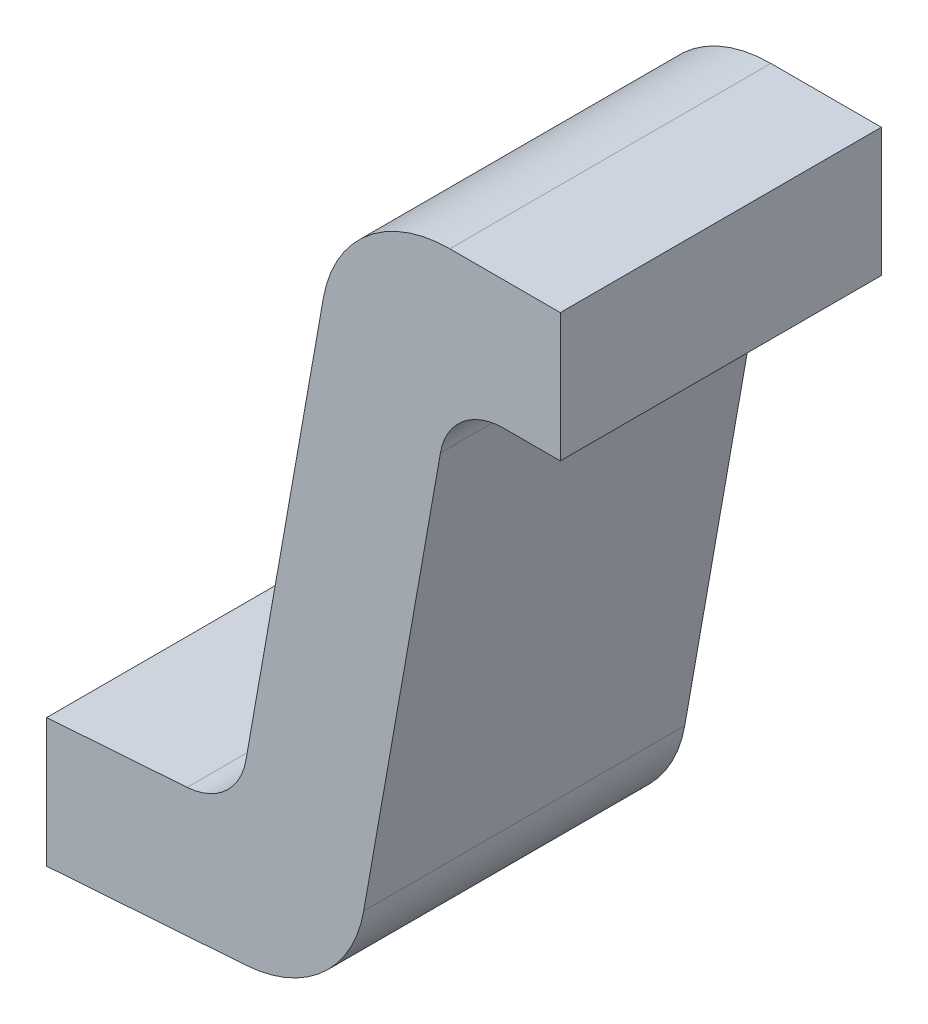
ISO-10303-21;
HEADER;
FILE_DESCRIPTION(('STEP AP214'),'2;1');
FILE_NAME('part.step','',(''),(''),'','','');
FILE_SCHEMA(('AUTOMOTIVE_DESIGN { 1 0 10303 214 1 1 1 1 }'));
ENDSEC;
DATA;
#1=APPLICATION_CONTEXT('core data for automotive mechanical design processes');
#2=APPLICATION_PROTOCOL_DEFINITION('international standard','automotive_design',2000,#1);
#3=PRODUCT_CONTEXT('',#1,'mechanical');
#4=PRODUCT('Part','Part','',(#3));
#5=PRODUCT_RELATED_PRODUCT_CATEGORY('part','',(#4));
#6=PRODUCT_DEFINITION_FORMATION('','',#4);
#7=PRODUCT_DEFINITION_CONTEXT('part definition',#1,'design');
#8=PRODUCT_DEFINITION('design','',#6,#7);
#9=PRODUCT_DEFINITION_SHAPE('','',#8);
#10=(LENGTH_UNIT() NAMED_UNIT(*) SI_UNIT(.MILLI.,.METRE.));
#11=(NAMED_UNIT(*) PLANE_ANGLE_UNIT() SI_UNIT($,.RADIAN.));
#12=(NAMED_UNIT(*) SI_UNIT($,.STERADIAN.) SOLID_ANGLE_UNIT());
#13=UNCERTAINTY_MEASURE_WITH_UNIT(LENGTH_MEASURE(1.E-05),#10,'distance_accuracy_value','');
#14=(GEOMETRIC_REPRESENTATION_CONTEXT(3) GLOBAL_UNCERTAINTY_ASSIGNED_CONTEXT((#13)) GLOBAL_UNIT_ASSIGNED_CONTEXT((#10,
#11,#12)) REPRESENTATION_CONTEXT('',''));
#15=CARTESIAN_POINT('',(0.,0.,0.));
#16=DIRECTION('',(0.,0.,1.));
#17=DIRECTION('',(1.,0.,0.));
#18=AXIS2_PLACEMENT_3D('',#15,#16,#17);
#19=CARTESIAN_POINT('',(0.35,0.02447438418023,0.));
#20=DIRECTION('',(0.98480775301219,-0.173648177667033,0.));
#21=DIRECTION('',(0.173648177667033,0.98480775301219,0.));
#22=AXIS2_PLACEMENT_3D('',#19,#20,#21);
#23=PLANE('',#22);
#24=DIRECTION('',(0.,0.,1.));
#25=VECTOR('',#24,1.);
#26=CARTESIAN_POINT('',(0.370350323791843,0.139886805525028,0.));
#27=LINE('',#26,#25);
#28=CARTESIAN_POINT('',(0.370350323791921,0.13988680552501,0.));
#29=VERTEX_POINT('',#28);
#30=CARTESIAN_POINT('',(0.370350323791921,0.13988680552501,0.375));
#31=VERTEX_POINT('',#30);
#32=EDGE_CURVE('E82',#29,#31,#27,.T.);
#33=ORIENTED_EDGE('',*,*,#32,.F.);
#34=DIRECTION('',(0.173648177666533,0.984807753012278,0.));
#35=VECTOR('',#34,1.);
#36=CARTESIAN_POINT('',(0.370350323792,0.139886805525,0.));
#37=LINE('',#36,#35);
#38=CARTESIAN_POINT('',(0.45994855289804,0.648023613324995,0.));
#39=VERTEX_POINT('',#38);
#40=EDGE_CURVE('E118',#29,#39,#37,.T.);
#41=ORIENTED_EDGE('',*,*,#40,.T.);
#42=DIRECTION('',(0.,0.,1.));
#43=VECTOR('',#42,1.);
#44=CARTESIAN_POINT('',(0.459948552898078,0.648023613324986,0.));
#45=LINE('',#44,#43);
#46=CARTESIAN_POINT('',(0.45994855289804,0.648023613324995,0.375));
#47=VERTEX_POINT('',#46);
#48=EDGE_CURVE('E96',#39,#47,#45,.T.);
#49=ORIENTED_EDGE('',*,*,#48,.T.);
#50=DIRECTION('',(0.173648177666533,0.984807753012278,0.));
#51=VECTOR('',#50,1.);
#52=CARTESIAN_POINT('',(0.370350323792,0.139886805525,0.375));
#53=LINE('',#52,#51);
#54=EDGE_CURVE('E94',#31,#47,#53,.T.);
#55=ORIENTED_EDGE('',*,*,#54,.F.);
#56=EDGE_LOOP('',(#33,#41,#49,#55));
#57=FACE_BOUND('',#56,.T.);
#58=ADVANCED_FACE('F17',(#57),#23,.T.);
#59=CARTESIAN_POINT('',(0.533809134374,0.635,0.));
#60=DIRECTION('',(0.,0.,1.));
#61=DIRECTION('',(1.,0.,0.));
#62=AXIS2_PLACEMENT_3D('',#59,#60,#61);
#63=CYLINDRICAL_SURFACE('',#62,0.075);
#64=DIRECTION('',(0.,0.,-1.));
#65=VECTOR('',#64,1.);
#66=CARTESIAN_POINT('',(0.533809134374,0.71,0.));
#67=LINE('',#66,#65);
#68=CARTESIAN_POINT('',(0.533809134374,0.71,0.375));
#69=VERTEX_POINT('',#68);
#70=CARTESIAN_POINT('',(0.533809134374,0.71,0.));
#71=VERTEX_POINT('',#70);
#72=EDGE_CURVE('E136',#69,#71,#67,.T.);
#73=ORIENTED_EDGE('',*,*,#72,.F.);
#74=CARTESIAN_POINT('',(0.533809134374,0.635,0.375));
#75=DIRECTION('',(0.,0.,1.));
#76=DIRECTION('',(1.,0.,0.));
#77=AXIS2_PLACEMENT_3D('',#74,#75,#76);
#78=CIRCLE('',#77,0.075);
#79=EDGE_CURVE('E100',#47,#69,#78,.F.);
#80=ORIENTED_EDGE('',*,*,#79,.F.);
#81=ORIENTED_EDGE('',*,*,#48,.F.);
#82=CARTESIAN_POINT('',(0.533809134374,0.635,0.));
#83=DIRECTION('',(0.,0.,1.));
#84=DIRECTION('',(1.,0.,0.));
#85=AXIS2_PLACEMENT_3D('',#82,#83,#84);
#86=CIRCLE('',#85,0.075);
#87=EDGE_CURVE('E161',#39,#71,#86,.F.);
#88=ORIENTED_EDGE('',*,*,#87,.T.);
#89=EDGE_LOOP('',(#73,#80,#81,#88));
#90=FACE_BOUND('',#89,.T.);
#91=ADVANCED_FACE('F294',(#90),#63,.F.);
#92=CARTESIAN_POINT('',(0.470876662036,0.71,0.));
#93=DIRECTION('',(0.,-1.,0.));
#94=DIRECTION('',(0.,0.,-1.));
#95=AXIS2_PLACEMENT_3D('',#92,#93,#94);
#96=PLANE('',#95);
#97=DIRECTION('',(0.,0.,1.));
#98=VECTOR('',#97,1.);
#99=CARTESIAN_POINT('',(0.6,0.71,0.));
#100=LINE('',#99,#98);
#101=CARTESIAN_POINT('',(0.6,0.71,0.375));
#102=VERTEX_POINT('',#101);
#103=CARTESIAN_POINT('',(0.6,0.71,0.));
#104=VERTEX_POINT('',#103);
#105=EDGE_CURVE('E124',#102,#104,#100,.F.);
#106=ORIENTED_EDGE('',*,*,#105,.F.);
#107=DIRECTION('',(1.,0.,0.));
#108=VECTOR('',#107,1.);
#109=CARTESIAN_POINT('',(0.320224528212,0.71,0.375));
#110=LINE('',#109,#108);
#111=EDGE_CURVE('E151',#69,#102,#110,.T.);
#112=ORIENTED_EDGE('',*,*,#111,.F.);
#113=ORIENTED_EDGE('',*,*,#72,.T.);
#114=DIRECTION('',(1.,0.,0.));
#115=VECTOR('',#114,1.);
#116=CARTESIAN_POINT('',(0.320224528212,0.71,0.));
#117=LINE('',#116,#115);
#118=EDGE_CURVE('E131',#71,#104,#117,.T.);
#119=ORIENTED_EDGE('',*,*,#118,.T.);
#120=EDGE_LOOP('',(#106,#112,#113,#119));
#121=FACE_BOUND('',#120,.T.);
#122=ADVANCED_FACE('F288',(#121),#96,.T.);
#123=CARTESIAN_POINT('',(0.6,0.71,0.));
#124=DIRECTION('',(1.,0.,0.));
#125=DIRECTION('',(0.,1.,0.));
#126=AXIS2_PLACEMENT_3D('',#123,#124,#125);
#127=PLANE('',#126);
#128=DIRECTION('',(0.,1.,0.));
#129=VECTOR('',#128,1.);
#130=CARTESIAN_POINT('',(0.6,0.412415878806,0.375));
#131=LINE('',#130,#129);
#132=CARTESIAN_POINT('',(0.6,0.86,0.375));
#133=VERTEX_POINT('',#132);
#134=EDGE_CURVE('E147',#102,#133,#131,.T.);
#135=ORIENTED_EDGE('',*,*,#134,.F.);
#136=ORIENTED_EDGE('',*,*,#105,.T.);
#137=DIRECTION('',(0.,1.,0.));
#138=VECTOR('',#137,1.);
#139=CARTESIAN_POINT('',(0.6,0.412415878806,0.));
#140=LINE('',#139,#138);
#141=CARTESIAN_POINT('',(0.6,0.86,0.));
#142=VERTEX_POINT('',#141);
#143=EDGE_CURVE('E127',#104,#142,#140,.T.);
#144=ORIENTED_EDGE('',*,*,#143,.T.);
#145=DIRECTION('',(0.,0.,1.));
#146=VECTOR('',#145,1.);
#147=CARTESIAN_POINT('',(0.6,0.86,0.));
#148=LINE('',#147,#146);
#149=EDGE_CURVE('E120',#133,#142,#148,.F.);
#150=ORIENTED_EDGE('',*,*,#149,.F.);
#151=EDGE_LOOP('',(#135,#136,#144,#150));
#152=FACE_BOUND('',#151,.T.);
#153=ADVANCED_FACE('F255',(#152),#127,.T.);
#154=CARTESIAN_POINT('',(0.6,0.86,0.));
#155=DIRECTION('',(0.,1.,0.));
#156=DIRECTION('',(0.,0.,1.));
#157=AXIS2_PLACEMENT_3D('',#154,#155,#156);
#158=PLANE('',#157);
#159=ORIENTED_EDGE('',*,*,#149,.T.);
#160=DIRECTION('',(1.,0.,0.));
#161=VECTOR('',#160,1.);
#162=CARTESIAN_POINT('',(0.320224528212,0.86,0.));
#163=LINE('',#162,#161);
#164=CARTESIAN_POINT('',(0.470876662036,0.86,0.));
#165=VERTEX_POINT('',#164);
#166=EDGE_CURVE('E130',#142,#165,#163,.F.);
#167=ORIENTED_EDGE('',*,*,#166,.T.);
#168=DIRECTION('',(0.,0.,1.));
#169=VECTOR('',#168,1.);
#170=CARTESIAN_POINT('',(0.470876662036,0.86,0.));
#171=LINE('',#170,#169);
#172=CARTESIAN_POINT('',(0.470876662036,0.86,0.375));
#173=VERTEX_POINT('',#172);
#174=EDGE_CURVE('E116',#173,#165,#171,.F.);
#175=ORIENTED_EDGE('',*,*,#174,.F.);
#176=DIRECTION('',(1.,0.,0.));
#177=VECTOR('',#176,1.);
#178=CARTESIAN_POINT('',(0.320224528212,0.86,0.375));
#179=LINE('',#178,#177);
#180=EDGE_CURVE('E150',#133,#173,#179,.F.);
#181=ORIENTED_EDGE('',*,*,#180,.F.);
#182=EDGE_LOOP('',(#159,#167,#175,#181));
#183=FACE_BOUND('',#182,.T.);
#184=ADVANCED_FACE('F237',(#183),#158,.T.);
#185=CARTESIAN_POINT('',(0.22262916084,0.165934032175,0.));
#186=DIRECTION('',(-0.0697564737441177,0.997564050259825,0.));
#187=DIRECTION('',(-0.997564050259825,-0.0697564737441177,0.));
#188=AXIS2_PLACEMENT_3D('',#185,#186,#187);
#189=PLANE('',#188);
#190=DIRECTION('',(0.,0.,1.));
#191=VECTOR('',#190,1.);
#192=CARTESIAN_POINT('',(0.,0.150366284712,0.));
#193=LINE('',#192,#191);
#194=CARTESIAN_POINT('',(0.,0.150366284712,0.375));
#195=VERTEX_POINT('',#194);
#196=CARTESIAN_POINT('',(0.,0.150366284712,0.));
#197=VERTEX_POINT('',#196);
#198=EDGE_CURVE('E123',#195,#197,#193,.F.);
#199=ORIENTED_EDGE('',*,*,#198,.F.);
#200=DIRECTION('',(-0.997564050259951,-0.069756473742309,0.));
#201=VECTOR('',#200,1.);
#202=CARTESIAN_POINT('',(0.164175476791,0.161846552403,0.375));
#203=LINE('',#202,#201);
#204=CARTESIAN_POINT('',(0.164175476790837,0.161846552403252,0.375));
#205=VERTEX_POINT('',#204);
#206=EDGE_CURVE('E144',#205,#195,#203,.T.);
#207=ORIENTED_EDGE('',*,*,#206,.F.);
#208=DIRECTION('',(0.,0.,1.));
#209=VECTOR('',#208,1.);
#210=CARTESIAN_POINT('',(0.164175476790963,0.161846552403524,0.));
#211=LINE('',#210,#209);
#212=CARTESIAN_POINT('',(0.164175476790837,0.161846552403252,0.));
#213=VERTEX_POINT('',#212);
#214=EDGE_CURVE('E91',#205,#213,#211,.F.);
#215=ORIENTED_EDGE('',*,*,#214,.T.);
#216=DIRECTION('',(-0.997564050259951,-0.069756473742309,0.));
#217=VECTOR('',#216,1.);
#218=CARTESIAN_POINT('',(0.164175476791,0.161846552403,0.));
#219=LINE('',#218,#217);
#220=EDGE_CURVE('E159',#213,#197,#219,.T.);
#221=ORIENTED_EDGE('',*,*,#220,.T.);
#222=EDGE_LOOP('',(#199,#207,#215,#221));
#223=FACE_BOUND('',#222,.T.);
#224=ADVANCED_FACE('F245',(#223),#189,.T.);
#225=CARTESIAN_POINT('',(0.,0.150366284712,0.));
#226=DIRECTION('',(-1.,0.,0.));
#227=DIRECTION('',(0.,-1.,0.));
#228=AXIS2_PLACEMENT_3D('',#225,#226,#227);
#229=PLANE('',#228);
#230=DIRECTION('',(0.,1.,0.));
#231=VECTOR('',#230,1.);
#232=CARTESIAN_POINT('',(0.,0.412415878806,0.375));
#233=LINE('',#232,#231);
#234=CARTESIAN_POINT('',(0.,0.,0.375));
#235=VERTEX_POINT('',#234);
#236=EDGE_CURVE('E142',#195,#235,#233,.F.);
#237=ORIENTED_EDGE('',*,*,#236,.F.);
#238=ORIENTED_EDGE('',*,*,#198,.T.);
#239=DIRECTION('',(0.,1.,0.));
#240=VECTOR('',#239,1.);
#241=CARTESIAN_POINT('',(0.,0.412415878806,0.));
#242=LINE('',#241,#240);
#243=CARTESIAN_POINT('',(0.,0.,0.));
#244=VERTEX_POINT('',#243);
#245=EDGE_CURVE('E182',#197,#244,#242,.F.);
#246=ORIENTED_EDGE('',*,*,#245,.T.);
#247=DIRECTION('',(0.,0.,1.));
#248=VECTOR('',#247,1.);
#249=CARTESIAN_POINT('',(0.,0.,0.));
#250=LINE('',#249,#248);
#251=EDGE_CURVE('E176',#235,#244,#250,.F.);
#252=ORIENTED_EDGE('',*,*,#251,.F.);
#253=EDGE_LOOP('',(#237,#238,#246,#252));
#254=FACE_BOUND('',#253,.T.);
#255=ADVANCED_FACE('F192',(#254),#229,.T.);
#256=CARTESIAN_POINT('',(0.,0.,0.));
#257=DIRECTION('',(0.0697564737441177,-0.997564050259825,0.));
#258=DIRECTION('',(0.997564050259825,0.0697564737441177,0.));
#259=AXIS2_PLACEMENT_3D('',#256,#257,#258);
#260=PLANE('',#259);
#261=ORIENTED_EDGE('',*,*,#251,.T.);
#262=DIRECTION('',(0.997564050259827,0.0697564737440867,0.));
#263=VECTOR('',#262,1.);
#264=CARTESIAN_POINT('',(0.,0.,0.));
#265=LINE('',#264,#263);
#266=CARTESIAN_POINT('',(0.233092631901806,0.016299424636223,0.));
#267=VERTEX_POINT('',#266);
#268=EDGE_CURVE('E156',#244,#267,#265,.T.);
#269=ORIENTED_EDGE('',*,*,#268,.T.);
#270=DIRECTION('',(0.,0.,1.));
#271=VECTOR('',#270,1.);
#272=CARTESIAN_POINT('',(0.233092631902025,0.0162994246360548,0.));
#273=LINE('',#272,#271);
#274=CARTESIAN_POINT('',(0.233092631901806,0.016299424636223,0.375));
#275=VERTEX_POINT('',#274);
#276=EDGE_CURVE('E76',#275,#267,#273,.F.);
#277=ORIENTED_EDGE('',*,*,#276,.F.);
#278=DIRECTION('',(0.997564050259827,0.0697564737440867,0.));
#279=VECTOR('',#278,1.);
#280=CARTESIAN_POINT('',(0.,0.,0.375));
#281=LINE('',#280,#279);
#282=EDGE_CURVE('E104',#235,#275,#281,.T.);
#283=ORIENTED_EDGE('',*,*,#282,.F.);
#284=EDGE_LOOP('',(#261,#269,#277,#283));
#285=FACE_BOUND('',#284,.T.);
#286=ADVANCED_FACE('F253',(#285),#260,.T.);
#287=CARTESIAN_POINT('',(0.22262916084,0.165934032175,0.));
#288=DIRECTION('',(0.,0.,1.));
#289=DIRECTION('',(1.,0.,0.));
#290=AXIS2_PLACEMENT_3D('',#287,#288,#289);
#291=CYLINDRICAL_SURFACE('',#290,0.15);
#292=CARTESIAN_POINT('',(0.22262916084,0.165934032175,0.));
#293=DIRECTION('',(0.,0.,1.));
#294=DIRECTION('',(1.,0.,0.));
#295=AXIS2_PLACEMENT_3D('',#292,#293,#294);
#296=CIRCLE('',#295,0.15);
#297=EDGE_CURVE('E88',#267,#29,#296,.T.);
#298=ORIENTED_EDGE('',*,*,#297,.T.);
#299=ORIENTED_EDGE('',*,*,#32,.T.);
#300=CARTESIAN_POINT('',(0.22262916084,0.165934032175,0.375));
#301=DIRECTION('',(0.,0.,1.));
#302=DIRECTION('',(1.,0.,0.));
#303=AXIS2_PLACEMENT_3D('',#300,#301,#302);
#304=CIRCLE('',#303,0.15);
#305=EDGE_CURVE('E20',#275,#31,#304,.T.);
#306=ORIENTED_EDGE('',*,*,#305,.F.);
#307=ORIENTED_EDGE('',*,*,#276,.T.);
#308=EDGE_LOOP('',(#298,#299,#306,#307));
#309=FACE_BOUND('',#308,.T.);
#310=ADVANCED_FACE('F84',(#309),#291,.T.);
#311=CARTESIAN_POINT('',(0.15894374126,0.236663856173,0.));
#312=DIRECTION('',(0.,0.,1.));
#313=DIRECTION('',(1.,0.,0.));
#314=AXIS2_PLACEMENT_3D('',#311,#312,#313);
#315=CYLINDRICAL_SURFACE('',#314,0.075);
#316=ORIENTED_EDGE('',*,*,#214,.F.);
#317=CARTESIAN_POINT('',(0.15894374126,0.236663856173,0.375));
#318=DIRECTION('',(0.,0.,1.));
#319=DIRECTION('',(1.,0.,0.));
#320=AXIS2_PLACEMENT_3D('',#317,#318,#319);
#321=CIRCLE('',#320,0.075);
#322=CARTESIAN_POINT('',(0.232804322735945,0.223640242847988,0.375));
#323=VERTEX_POINT('',#322);
#324=EDGE_CURVE('E165',#323,#205,#321,.F.);
#325=ORIENTED_EDGE('',*,*,#324,.F.);
#326=DIRECTION('',(0.,0.,1.));
#327=VECTOR('',#326,1.);
#328=CARTESIAN_POINT('',(0.232804322735949,0.223640242848009,0.));
#329=LINE('',#328,#327);
#330=CARTESIAN_POINT('',(0.232804322735945,0.223640242847988,0.));
#331=VERTEX_POINT('',#330);
#332=EDGE_CURVE('E155',#331,#323,#329,.T.);
#333=ORIENTED_EDGE('',*,*,#332,.F.);
#334=CARTESIAN_POINT('',(0.15894374126,0.236663856173,0.));
#335=DIRECTION('',(0.,0.,1.));
#336=DIRECTION('',(1.,0.,0.));
#337=AXIS2_PLACEMENT_3D('',#334,#335,#336);
#338=CIRCLE('',#337,0.075);
#339=EDGE_CURVE('E157',#331,#213,#338,.F.);
#340=ORIENTED_EDGE('',*,*,#339,.T.);
#341=EDGE_LOOP('',(#316,#325,#333,#340));
#342=FACE_BOUND('',#341,.T.);
#343=ADVANCED_FACE('F244',(#342),#315,.F.);
#344=CARTESIAN_POINT('',(0.320224528212,0.412415878806,0.375));
#345=DIRECTION('',(0.,0.,1.));
#346=DIRECTION('',(1.,0.,0.));
#347=AXIS2_PLACEMENT_3D('',#344,#345,#346);
#348=PLANE('',#347);
#349=ORIENTED_EDGE('',*,*,#236,.T.);
#350=ORIENTED_EDGE('',*,*,#282,.T.);
#351=ORIENTED_EDGE('',*,*,#305,.T.);
#352=ORIENTED_EDGE('',*,*,#54,.T.);
#353=ORIENTED_EDGE('',*,*,#79,.T.);
#354=ORIENTED_EDGE('',*,*,#111,.T.);
#355=ORIENTED_EDGE('',*,*,#134,.T.);
#356=ORIENTED_EDGE('',*,*,#180,.T.);
#357=CARTESIAN_POINT('',(0.470876662036,0.71,0.375));
#358=DIRECTION('',(0.,0.,1.));
#359=DIRECTION('',(1.,0.,0.));
#360=AXIS2_PLACEMENT_3D('',#357,#358,#359);
#361=CIRCLE('',#360,0.15);
#362=CARTESIAN_POINT('',(0.323155499083756,0.736047226650086,0.375));
#363=VERTEX_POINT('',#362);
#364=EDGE_CURVE('E119',#363,#173,#361,.F.);
#365=ORIENTED_EDGE('',*,*,#364,.F.);
#366=DIRECTION('',(-0.173648177667033,-0.98480775301219,0.));
#367=VECTOR('',#366,1.);
#368=CARTESIAN_POINT('',(0.345011717359,0.86,0.375));
#369=LINE('',#368,#367);
#370=EDGE_CURVE('E221',#323,#363,#369,.F.);
#371=ORIENTED_EDGE('',*,*,#370,.F.);
#372=ORIENTED_EDGE('',*,*,#324,.T.);
#373=ORIENTED_EDGE('',*,*,#206,.T.);
#374=EDGE_LOOP('',(#349,#350,#351,#352,#353,#354,#355,#356,#365,#371,#372,#373));
#375=FACE_BOUND('',#374,.T.);
#376=ADVANCED_FACE('F103',(#375),#348,.T.);
#377=CARTESIAN_POINT('',(0.470876662036,0.71,0.));
#378=DIRECTION('',(0.,0.,1.));
#379=DIRECTION('',(1.,0.,0.));
#380=AXIS2_PLACEMENT_3D('',#377,#378,#379);
#381=CYLINDRICAL_SURFACE('',#380,0.15);
#382=CARTESIAN_POINT('',(0.470876662036,0.71,0.));
#383=DIRECTION('',(0.,0.,1.));
#384=DIRECTION('',(1.,0.,0.));
#385=AXIS2_PLACEMENT_3D('',#382,#383,#384);
#386=CIRCLE('',#385,0.15);
#387=CARTESIAN_POINT('',(0.323155499083756,0.736047226650086,0.));
#388=VERTEX_POINT('',#387);
#389=EDGE_CURVE('E35',#165,#388,#386,.T.);
#390=ORIENTED_EDGE('',*,*,#389,.T.);
#391=DIRECTION('',(0.,0.,1.));
#392=VECTOR('',#391,1.);
#393=CARTESIAN_POINT('',(0.323155499083748,0.736047226650044,0.));
#394=LINE('',#393,#392);
#395=EDGE_CURVE('E26',#363,#388,#394,.F.);
#396=ORIENTED_EDGE('',*,*,#395,.F.);
#397=ORIENTED_EDGE('',*,*,#364,.T.);
#398=ORIENTED_EDGE('',*,*,#174,.T.);
#399=EDGE_LOOP('',(#390,#396,#397,#398));
#400=FACE_BOUND('',#399,.T.);
#401=ADVANCED_FACE('F239',(#400),#381,.T.);
#402=CARTESIAN_POINT('',(0.320224528212,0.412415878806,0.));
#403=DIRECTION('',(0.,0.,1.));
#404=DIRECTION('',(1.,0.,0.));
#405=AXIS2_PLACEMENT_3D('',#402,#403,#404);
#406=PLANE('',#405);
#407=ORIENTED_EDGE('',*,*,#268,.F.);
#408=ORIENTED_EDGE('',*,*,#245,.F.);
#409=ORIENTED_EDGE('',*,*,#220,.F.);
#410=ORIENTED_EDGE('',*,*,#339,.F.);
#411=DIRECTION('',(-0.173648177667033,-0.98480775301219,0.));
#412=VECTOR('',#411,1.);
#413=CARTESIAN_POINT('',(0.345011717359,0.86,0.));
#414=LINE('',#413,#412);
#415=EDGE_CURVE('E11',#388,#331,#414,.T.);
#416=ORIENTED_EDGE('',*,*,#415,.F.);
#417=ORIENTED_EDGE('',*,*,#389,.F.);
#418=ORIENTED_EDGE('',*,*,#166,.F.);
#419=ORIENTED_EDGE('',*,*,#143,.F.);
#420=ORIENTED_EDGE('',*,*,#118,.F.);
#421=ORIENTED_EDGE('',*,*,#87,.F.);
#422=ORIENTED_EDGE('',*,*,#40,.F.);
#423=ORIENTED_EDGE('',*,*,#297,.F.);
#424=EDGE_LOOP('',(#407,#408,#409,#410,#416,#417,#418,#419,#420,#421,#422,#423));
#425=FACE_BOUND('',#424,.T.);
#426=ADVANCED_FACE('F200',(#425),#406,.F.);
#427=CARTESIAN_POINT('',(0.345011717359,0.86,0.));
#428=DIRECTION('',(-0.98480775301219,0.173648177667033,0.));
#429=DIRECTION('',(-0.173648177667033,-0.98480775301219,0.));
#430=AXIS2_PLACEMENT_3D('',#427,#428,#429);
#431=PLANE('',#430);
#432=ORIENTED_EDGE('',*,*,#395,.T.);
#433=ORIENTED_EDGE('',*,*,#415,.T.);
#434=ORIENTED_EDGE('',*,*,#332,.T.);
#435=ORIENTED_EDGE('',*,*,#370,.T.);
#436=EDGE_LOOP('',(#432,#433,#434,#435));
#437=FACE_BOUND('',#436,.T.);
#438=ADVANCED_FACE('F241',(#437),#431,.T.);
#439=CLOSED_SHELL('',(#58,#91,#122,#153,#184,#224,#255,#286,#310,#343,#376,#401,#426,#438));
#440=MANIFOLD_SOLID_BREP('B1',#439);
#441=ADVANCED_BREP_SHAPE_REPRESENTATION('',(#18,#440),#14);
#442=SHAPE_DEFINITION_REPRESENTATION(#9,#441);
ENDSEC;
END-ISO-10303-21;
